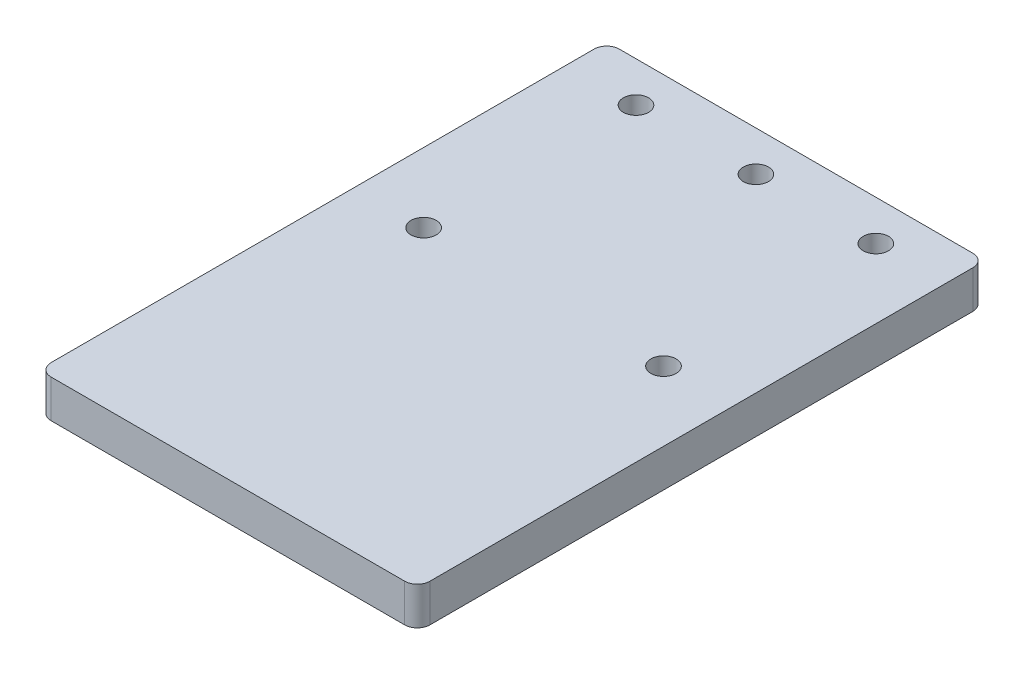
ISO-10303-21;
HEADER;
FILE_DESCRIPTION(('STEP AP214'),'2;1');
FILE_NAME('part.step','',(''),(''),'','','');
FILE_SCHEMA(('AUTOMOTIVE_DESIGN { 1 0 10303 214 1 1 1 1 }'));
ENDSEC;
DATA;
#1=APPLICATION_CONTEXT('core data for automotive mechanical design processes');
#2=APPLICATION_PROTOCOL_DEFINITION('international standard','automotive_design',2000,#1);
#3=PRODUCT_CONTEXT('',#1,'mechanical');
#4=PRODUCT('Part','Part','',(#3));
#5=PRODUCT_RELATED_PRODUCT_CATEGORY('part','',(#4));
#6=PRODUCT_DEFINITION_FORMATION('','',#4);
#7=PRODUCT_DEFINITION_CONTEXT('part definition',#1,'design');
#8=PRODUCT_DEFINITION('design','',#6,#7);
#9=PRODUCT_DEFINITION_SHAPE('','',#8);
#10=(LENGTH_UNIT() NAMED_UNIT(*) SI_UNIT(.MILLI.,.METRE.));
#11=(NAMED_UNIT(*) PLANE_ANGLE_UNIT() SI_UNIT($,.RADIAN.));
#12=(NAMED_UNIT(*) SI_UNIT($,.STERADIAN.) SOLID_ANGLE_UNIT());
#13=UNCERTAINTY_MEASURE_WITH_UNIT(LENGTH_MEASURE(1.E-05),#10,'distance_accuracy_value','');
#14=(GEOMETRIC_REPRESENTATION_CONTEXT(3) GLOBAL_UNCERTAINTY_ASSIGNED_CONTEXT((#13)) GLOBAL_UNIT_ASSIGNED_CONTEXT((#10,
#11,#12)) REPRESENTATION_CONTEXT('',''));
#15=CARTESIAN_POINT('',(0.,0.,0.));
#16=DIRECTION('',(0.,0.,1.));
#17=DIRECTION('',(1.,0.,0.));
#18=AXIS2_PLACEMENT_3D('',#15,#16,#17);
#19=CARTESIAN_POINT('',(0.,3.,0.));
#20=DIRECTION('',(0.,1.,0.));
#21=DIRECTION('',(0.,0.,1.));
#22=AXIS2_PLACEMENT_3D('',#19,#20,#21);
#23=PLANE('',#22);
#24=CARTESIAN_POINT('',(24.5,3.,3.18));
#25=DIRECTION('',(0.,1.,0.));
#26=DIRECTION('',(0.,0.,1.));
#27=AXIS2_PLACEMENT_3D('',#24,#25,#26);
#28=CIRCLE('',#27,0.999999999999998);
#29=CARTESIAN_POINT('',(24.5,3.,4.18));
#30=VERTEX_POINT('',#29);
#31=EDGE_CURVE('E235',#30,#30,#28,.T.);
#32=ORIENTED_EDGE('',*,*,#31,.F.);
#33=EDGE_LOOP('',(#32));
#34=FACE_BOUND('',#33,.T.);
#35=CARTESIAN_POINT('',(5.5,3.,20.));
#36=DIRECTION('',(0.,1.,0.));
#37=DIRECTION('',(0.,0.,1.));
#38=AXIS2_PLACEMENT_3D('',#35,#36,#37);
#39=CIRCLE('',#38,1.);
#40=CARTESIAN_POINT('',(5.5,3.,21.));
#41=VERTEX_POINT('',#40);
#42=EDGE_CURVE('E221',#41,#41,#39,.T.);
#43=ORIENTED_EDGE('',*,*,#42,.F.);
#44=EDGE_LOOP('',(#43));
#45=FACE_BOUND('',#44,.T.);
#46=DIRECTION('',(-1.,0.,0.));
#47=VECTOR('',#46,1.);
#48=CARTESIAN_POINT('',(0.,3.,0.));
#49=LINE('',#48,#47);
#50=CARTESIAN_POINT('',(29.,3.,0.));
#51=VERTEX_POINT('',#50);
#52=CARTESIAN_POINT('',(1.,3.,0.));
#53=VERTEX_POINT('',#52);
#54=EDGE_CURVE('E153',#51,#53,#49,.T.);
#55=ORIENTED_EDGE('',*,*,#54,.T.);
#56=CARTESIAN_POINT('',(1.,3.,1.));
#57=DIRECTION('',(0.,1.,0.));
#58=DIRECTION('',(0.,0.,1.));
#59=AXIS2_PLACEMENT_3D('',#56,#57,#58);
#60=CIRCLE('',#59,1.);
#61=CARTESIAN_POINT('',(0.,3.,1.));
#62=VERTEX_POINT('',#61);
#63=EDGE_CURVE('E182',#53,#62,#60,.T.);
#64=ORIENTED_EDGE('',*,*,#63,.T.);
#65=DIRECTION('',(0.,0.,1.));
#66=VECTOR('',#65,1.);
#67=CARTESIAN_POINT('',(0.,3.,0.));
#68=LINE('',#67,#66);
#69=CARTESIAN_POINT('',(0.,3.,44.));
#70=VERTEX_POINT('',#69);
#71=EDGE_CURVE('E131',#62,#70,#68,.T.);
#72=ORIENTED_EDGE('',*,*,#71,.T.);
#73=CARTESIAN_POINT('',(1.00000000000001,3.,44.));
#74=DIRECTION('',(0.,1.,0.));
#75=DIRECTION('',(0.,0.,1.));
#76=AXIS2_PLACEMENT_3D('',#73,#74,#75);
#77=CIRCLE('',#76,1.);
#78=CARTESIAN_POINT('',(1.00000000000001,3.,45.));
#79=VERTEX_POINT('',#78);
#80=EDGE_CURVE('E176',#70,#79,#77,.T.);
#81=ORIENTED_EDGE('',*,*,#80,.T.);
#82=DIRECTION('',(1.,0.,0.));
#83=VECTOR('',#82,1.);
#84=CARTESIAN_POINT('',(0.,3.,45.));
#85=LINE('',#84,#83);
#86=CARTESIAN_POINT('',(29.,3.,45.));
#87=VERTEX_POINT('',#86);
#88=EDGE_CURVE('E195',#79,#87,#85,.T.);
#89=ORIENTED_EDGE('',*,*,#88,.T.);
#90=CARTESIAN_POINT('',(29.,3.,44.));
#91=DIRECTION('',(0.,1.,0.));
#92=DIRECTION('',(0.,0.,1.));
#93=AXIS2_PLACEMENT_3D('',#90,#91,#92);
#94=CIRCLE('',#93,1.);
#95=CARTESIAN_POINT('',(30.,3.,44.));
#96=VERTEX_POINT('',#95);
#97=EDGE_CURVE('E65',#87,#96,#94,.T.);
#98=ORIENTED_EDGE('',*,*,#97,.T.);
#99=DIRECTION('',(0.,0.,-1.));
#100=VECTOR('',#99,1.);
#101=CARTESIAN_POINT('',(30.,3.,0.));
#102=LINE('',#101,#100);
#103=CARTESIAN_POINT('',(30.,3.,1.));
#104=VERTEX_POINT('',#103);
#105=EDGE_CURVE('E202',#96,#104,#102,.T.);
#106=ORIENTED_EDGE('',*,*,#105,.T.);
#107=CARTESIAN_POINT('',(29.,3.,1.));
#108=DIRECTION('',(0.,1.,0.));
#109=DIRECTION('',(0.,0.,1.));
#110=AXIS2_PLACEMENT_3D('',#107,#108,#109);
#111=CIRCLE('',#110,1.);
#112=EDGE_CURVE('E179',#104,#51,#111,.T.);
#113=ORIENTED_EDGE('',*,*,#112,.T.);
#114=EDGE_LOOP('',(#55,#64,#72,#81,#89,#98,#106,#113));
#115=FACE_BOUND('',#114,.T.);
#116=CARTESIAN_POINT('',(15.,3.,3.18));
#117=DIRECTION('',(0.,1.,0.));
#118=DIRECTION('',(0.,0.,1.));
#119=AXIS2_PLACEMENT_3D('',#116,#117,#118);
#120=CIRCLE('',#119,1.);
#121=CARTESIAN_POINT('',(15.,3.,4.18));
#122=VERTEX_POINT('',#121);
#123=EDGE_CURVE('E142',#122,#122,#120,.T.);
#124=ORIENTED_EDGE('',*,*,#123,.F.);
#125=EDGE_LOOP('',(#124));
#126=FACE_BOUND('',#125,.T.);
#127=CARTESIAN_POINT('',(24.5,3.,20.));
#128=DIRECTION('',(0.,1.,0.));
#129=DIRECTION('',(0.,0.,1.));
#130=AXIS2_PLACEMENT_3D('',#127,#128,#129);
#131=CIRCLE('',#130,0.999999999999998);
#132=CARTESIAN_POINT('',(24.5,3.,21.));
#133=VERTEX_POINT('',#132);
#134=EDGE_CURVE('E227',#133,#133,#131,.T.);
#135=ORIENTED_EDGE('',*,*,#134,.F.);
#136=EDGE_LOOP('',(#135));
#137=FACE_BOUND('',#136,.T.);
#138=CARTESIAN_POINT('',(5.5,3.,3.18));
#139=DIRECTION('',(0.,1.,0.));
#140=DIRECTION('',(0.,0.,1.));
#141=AXIS2_PLACEMENT_3D('',#138,#139,#140);
#142=CIRCLE('',#141,1.);
#143=CARTESIAN_POINT('',(5.5,3.,4.18));
#144=VERTEX_POINT('',#143);
#145=EDGE_CURVE('E243',#144,#144,#142,.T.);
#146=ORIENTED_EDGE('',*,*,#145,.F.);
#147=EDGE_LOOP('',(#146));
#148=FACE_BOUND('',#147,.T.);
#149=ADVANCED_FACE('F42',(#34,#45,#115,#126,#137,#148),#23,.T.);
#150=CARTESIAN_POINT('',(0.,0.,0.));
#151=DIRECTION('',(0.,1.,0.));
#152=DIRECTION('',(0.,0.,1.));
#153=AXIS2_PLACEMENT_3D('',#150,#151,#152);
#154=PLANE('',#153);
#155=DIRECTION('',(0.,0.,1.));
#156=VECTOR('',#155,1.);
#157=CARTESIAN_POINT('',(0.,0.,0.));
#158=LINE('',#157,#156);
#159=CARTESIAN_POINT('',(0.,0.,1.));
#160=VERTEX_POINT('',#159);
#161=CARTESIAN_POINT('',(0.,0.,44.));
#162=VERTEX_POINT('',#161);
#163=EDGE_CURVE('E128',#160,#162,#158,.T.);
#164=ORIENTED_EDGE('',*,*,#163,.F.);
#165=CARTESIAN_POINT('',(1.,0.,1.));
#166=DIRECTION('',(0.,1.,0.));
#167=DIRECTION('',(0.,0.,1.));
#168=AXIS2_PLACEMENT_3D('',#165,#166,#167);
#169=CIRCLE('',#168,1.);
#170=CARTESIAN_POINT('',(1.,0.,0.));
#171=VERTEX_POINT('',#170);
#172=EDGE_CURVE('E110',#160,#171,#169,.F.);
#173=ORIENTED_EDGE('',*,*,#172,.T.);
#174=DIRECTION('',(-1.,0.,0.));
#175=VECTOR('',#174,1.);
#176=CARTESIAN_POINT('',(0.,0.,0.));
#177=LINE('',#176,#175);
#178=CARTESIAN_POINT('',(29.,0.,0.));
#179=VERTEX_POINT('',#178);
#180=EDGE_CURVE('E158',#179,#171,#177,.T.);
#181=ORIENTED_EDGE('',*,*,#180,.F.);
#182=CARTESIAN_POINT('',(29.,0.,1.));
#183=DIRECTION('',(0.,1.,0.));
#184=DIRECTION('',(0.,0.,1.));
#185=AXIS2_PLACEMENT_3D('',#182,#183,#184);
#186=CIRCLE('',#185,1.);
#187=CARTESIAN_POINT('',(30.,0.,1.));
#188=VERTEX_POINT('',#187);
#189=EDGE_CURVE('E122',#179,#188,#186,.F.);
#190=ORIENTED_EDGE('',*,*,#189,.T.);
#191=DIRECTION('',(0.,0.,-1.));
#192=VECTOR('',#191,1.);
#193=CARTESIAN_POINT('',(30.,0.,0.));
#194=LINE('',#193,#192);
#195=CARTESIAN_POINT('',(30.,0.,44.));
#196=VERTEX_POINT('',#195);
#197=EDGE_CURVE('E147',#196,#188,#194,.T.);
#198=ORIENTED_EDGE('',*,*,#197,.F.);
#199=CARTESIAN_POINT('',(29.,0.,44.));
#200=DIRECTION('',(0.,1.,0.));
#201=DIRECTION('',(0.,0.,1.));
#202=AXIS2_PLACEMENT_3D('',#199,#200,#201);
#203=CIRCLE('',#202,1.);
#204=CARTESIAN_POINT('',(29.,0.,45.));
#205=VERTEX_POINT('',#204);
#206=EDGE_CURVE('E133',#196,#205,#203,.F.);
#207=ORIENTED_EDGE('',*,*,#206,.T.);
#208=DIRECTION('',(1.,0.,0.));
#209=VECTOR('',#208,1.);
#210=CARTESIAN_POINT('',(0.,0.,45.));
#211=LINE('',#210,#209);
#212=CARTESIAN_POINT('',(1.00000000000001,0.,45.));
#213=VERTEX_POINT('',#212);
#214=EDGE_CURVE('E141',#213,#205,#211,.T.);
#215=ORIENTED_EDGE('',*,*,#214,.F.);
#216=CARTESIAN_POINT('',(1.00000000000001,0.,44.));
#217=DIRECTION('',(0.,1.,0.));
#218=DIRECTION('',(0.,0.,1.));
#219=AXIS2_PLACEMENT_3D('',#216,#217,#218);
#220=CIRCLE('',#219,1.);
#221=EDGE_CURVE('E139',#213,#162,#220,.F.);
#222=ORIENTED_EDGE('',*,*,#221,.T.);
#223=EDGE_LOOP('',(#164,#173,#181,#190,#198,#207,#215,#222));
#224=FACE_BOUND('',#223,.T.);
#225=CARTESIAN_POINT('',(15.,0.,3.18));
#226=DIRECTION('',(0.,1.,0.));
#227=DIRECTION('',(0.,0.,1.));
#228=AXIS2_PLACEMENT_3D('',#225,#226,#227);
#229=CIRCLE('',#228,1.);
#230=CARTESIAN_POINT('',(15.,0.,4.18));
#231=VERTEX_POINT('',#230);
#232=EDGE_CURVE('E150',#231,#231,#229,.T.);
#233=ORIENTED_EDGE('',*,*,#232,.T.);
#234=EDGE_LOOP('',(#233));
#235=FACE_BOUND('',#234,.T.);
#236=CARTESIAN_POINT('',(5.5,0.,20.));
#237=DIRECTION('',(0.,1.,0.));
#238=DIRECTION('',(0.,0.,1.));
#239=AXIS2_PLACEMENT_3D('',#236,#237,#238);
#240=CIRCLE('',#239,1.);
#241=CARTESIAN_POINT('',(5.5,0.,21.));
#242=VERTEX_POINT('',#241);
#243=EDGE_CURVE('E223',#242,#242,#240,.T.);
#244=ORIENTED_EDGE('',*,*,#243,.T.);
#245=EDGE_LOOP('',(#244));
#246=FACE_BOUND('',#245,.T.);
#247=CARTESIAN_POINT('',(24.5,0.,20.));
#248=DIRECTION('',(0.,1.,0.));
#249=DIRECTION('',(0.,0.,1.));
#250=AXIS2_PLACEMENT_3D('',#247,#248,#249);
#251=CIRCLE('',#250,0.999999999999998);
#252=CARTESIAN_POINT('',(24.5,0.,21.));
#253=VERTEX_POINT('',#252);
#254=EDGE_CURVE('E231',#253,#253,#251,.T.);
#255=ORIENTED_EDGE('',*,*,#254,.T.);
#256=EDGE_LOOP('',(#255));
#257=FACE_BOUND('',#256,.T.);
#258=CARTESIAN_POINT('',(24.5,0.,3.18));
#259=DIRECTION('',(0.,1.,0.));
#260=DIRECTION('',(0.,0.,1.));
#261=AXIS2_PLACEMENT_3D('',#258,#259,#260);
#262=CIRCLE('',#261,0.999999999999998);
#263=CARTESIAN_POINT('',(24.5,0.,4.18));
#264=VERTEX_POINT('',#263);
#265=EDGE_CURVE('E239',#264,#264,#262,.T.);
#266=ORIENTED_EDGE('',*,*,#265,.T.);
#267=EDGE_LOOP('',(#266));
#268=FACE_BOUND('',#267,.T.);
#269=CARTESIAN_POINT('',(5.5,0.,3.18));
#270=DIRECTION('',(0.,1.,0.));
#271=DIRECTION('',(0.,0.,1.));
#272=AXIS2_PLACEMENT_3D('',#269,#270,#271);
#273=CIRCLE('',#272,1.);
#274=CARTESIAN_POINT('',(5.5,0.,4.18));
#275=VERTEX_POINT('',#274);
#276=EDGE_CURVE('E247',#275,#275,#273,.T.);
#277=ORIENTED_EDGE('',*,*,#276,.T.);
#278=EDGE_LOOP('',(#277));
#279=FACE_BOUND('',#278,.T.);
#280=ADVANCED_FACE('F136',(#224,#235,#246,#257,#268,#279),#154,.F.);
#281=CARTESIAN_POINT('',(0.,3.,0.));
#282=DIRECTION('',(1.,0.,0.));
#283=DIRECTION('',(0.,0.,-1.));
#284=AXIS2_PLACEMENT_3D('',#281,#282,#283);
#285=PLANE('',#284);
#286=ORIENTED_EDGE('',*,*,#71,.F.);
#287=DIRECTION('',(0.,-1.,0.));
#288=VECTOR('',#287,1.);
#289=CARTESIAN_POINT('',(0.,3.,1.));
#290=LINE('',#289,#288);
#291=EDGE_CURVE('E114',#62,#160,#290,.T.);
#292=ORIENTED_EDGE('',*,*,#291,.T.);
#293=ORIENTED_EDGE('',*,*,#163,.T.);
#294=DIRECTION('',(0.,-1.,0.));
#295=VECTOR('',#294,1.);
#296=CARTESIAN_POINT('',(0.,3.,44.));
#297=LINE('',#296,#295);
#298=EDGE_CURVE('E134',#162,#70,#297,.F.);
#299=ORIENTED_EDGE('',*,*,#298,.T.);
#300=EDGE_LOOP('',(#286,#292,#293,#299));
#301=FACE_BOUND('',#300,.T.);
#302=ADVANCED_FACE('F127',(#301),#285,.F.);
#303=CARTESIAN_POINT('',(0.,3.,45.));
#304=DIRECTION('',(0.,0.,-1.));
#305=DIRECTION('',(-1.,0.,0.));
#306=AXIS2_PLACEMENT_3D('',#303,#304,#305);
#307=PLANE('',#306);
#308=ORIENTED_EDGE('',*,*,#88,.F.);
#309=DIRECTION('',(0.,-1.,0.));
#310=VECTOR('',#309,1.);
#311=CARTESIAN_POINT('',(1.00000000000001,3.,45.));
#312=LINE('',#311,#310);
#313=EDGE_CURVE('E11',#79,#213,#312,.T.);
#314=ORIENTED_EDGE('',*,*,#313,.T.);
#315=ORIENTED_EDGE('',*,*,#214,.T.);
#316=DIRECTION('',(0.,-1.,0.));
#317=VECTOR('',#316,1.);
#318=CARTESIAN_POINT('',(29.,3.,45.));
#319=LINE('',#318,#317);
#320=EDGE_CURVE('E51',#205,#87,#319,.F.);
#321=ORIENTED_EDGE('',*,*,#320,.T.);
#322=EDGE_LOOP('',(#308,#314,#315,#321));
#323=FACE_BOUND('',#322,.T.);
#324=ADVANCED_FACE('F194',(#323),#307,.F.);
#325=CARTESIAN_POINT('',(30.,3.,0.));
#326=DIRECTION('',(-1.,0.,0.));
#327=DIRECTION('',(0.,0.,1.));
#328=AXIS2_PLACEMENT_3D('',#325,#326,#327);
#329=PLANE('',#328);
#330=ORIENTED_EDGE('',*,*,#197,.T.);
#331=DIRECTION('',(0.,-1.,0.));
#332=VECTOR('',#331,1.);
#333=CARTESIAN_POINT('',(30.,3.,1.));
#334=LINE('',#333,#332);
#335=EDGE_CURVE('E58',#188,#104,#334,.F.);
#336=ORIENTED_EDGE('',*,*,#335,.T.);
#337=ORIENTED_EDGE('',*,*,#105,.F.);
#338=DIRECTION('',(0.,-1.,0.));
#339=VECTOR('',#338,1.);
#340=CARTESIAN_POINT('',(30.,3.,44.));
#341=LINE('',#340,#339);
#342=EDGE_CURVE('E185',#96,#196,#341,.T.);
#343=ORIENTED_EDGE('',*,*,#342,.T.);
#344=EDGE_LOOP('',(#330,#336,#337,#343));
#345=FACE_BOUND('',#344,.T.);
#346=ADVANCED_FACE('F206',(#345),#329,.F.);
#347=CARTESIAN_POINT('',(0.,3.,0.));
#348=DIRECTION('',(0.,0.,1.));
#349=DIRECTION('',(1.,0.,0.));
#350=AXIS2_PLACEMENT_3D('',#347,#348,#349);
#351=PLANE('',#350);
#352=ORIENTED_EDGE('',*,*,#180,.T.);
#353=DIRECTION('',(0.,-1.,0.));
#354=VECTOR('',#353,1.);
#355=CARTESIAN_POINT('',(1.,3.,0.));
#356=LINE('',#355,#354);
#357=EDGE_CURVE('E115',#171,#53,#356,.F.);
#358=ORIENTED_EDGE('',*,*,#357,.T.);
#359=ORIENTED_EDGE('',*,*,#54,.F.);
#360=DIRECTION('',(0.,-1.,0.));
#361=VECTOR('',#360,1.);
#362=CARTESIAN_POINT('',(29.,3.,0.));
#363=LINE('',#362,#361);
#364=EDGE_CURVE('E121',#51,#179,#363,.T.);
#365=ORIENTED_EDGE('',*,*,#364,.T.);
#366=EDGE_LOOP('',(#352,#358,#359,#365));
#367=FACE_BOUND('',#366,.T.);
#368=ADVANCED_FACE('F213',(#367),#351,.F.);
#369=CARTESIAN_POINT('',(15.,3.,3.18));
#370=DIRECTION('',(0.,-1.,0.));
#371=DIRECTION('',(0.,0.,-1.));
#372=AXIS2_PLACEMENT_3D('',#369,#370,#371);
#373=CYLINDRICAL_SURFACE('',#372,1.);
#374=ORIENTED_EDGE('',*,*,#123,.T.);
#375=EDGE_LOOP('',(#374));
#376=FACE_BOUND('',#375,.T.);
#377=ORIENTED_EDGE('',*,*,#232,.F.);
#378=EDGE_LOOP('',(#377));
#379=FACE_BOUND('',#378,.T.);
#380=ADVANCED_FACE('F269',(#376,#379),#373,.F.);
#381=CARTESIAN_POINT('',(5.5,3.,20.));
#382=DIRECTION('',(0.,-1.,0.));
#383=DIRECTION('',(0.,0.,-1.));
#384=AXIS2_PLACEMENT_3D('',#381,#382,#383);
#385=CYLINDRICAL_SURFACE('',#384,1.);
#386=ORIENTED_EDGE('',*,*,#42,.T.);
#387=EDGE_LOOP('',(#386));
#388=FACE_BOUND('',#387,.T.);
#389=ORIENTED_EDGE('',*,*,#243,.F.);
#390=EDGE_LOOP('',(#389));
#391=FACE_BOUND('',#390,.T.);
#392=ADVANCED_FACE('F368',(#388,#391),#385,.F.);
#393=CARTESIAN_POINT('',(24.5,3.,20.));
#394=DIRECTION('',(0.,-1.,0.));
#395=DIRECTION('',(0.,0.,-1.));
#396=AXIS2_PLACEMENT_3D('',#393,#394,#395);
#397=CYLINDRICAL_SURFACE('',#396,0.999999999999998);
#398=ORIENTED_EDGE('',*,*,#134,.T.);
#399=EDGE_LOOP('',(#398));
#400=FACE_BOUND('',#399,.T.);
#401=ORIENTED_EDGE('',*,*,#254,.F.);
#402=EDGE_LOOP('',(#401));
#403=FACE_BOUND('',#402,.T.);
#404=ADVANCED_FACE('F377',(#400,#403),#397,.F.);
#405=CARTESIAN_POINT('',(24.5,3.,3.18));
#406=DIRECTION('',(0.,-1.,0.));
#407=DIRECTION('',(0.,0.,-1.));
#408=AXIS2_PLACEMENT_3D('',#405,#406,#407);
#409=CYLINDRICAL_SURFACE('',#408,0.999999999999998);
#410=ORIENTED_EDGE('',*,*,#31,.T.);
#411=EDGE_LOOP('',(#410));
#412=FACE_BOUND('',#411,.T.);
#413=ORIENTED_EDGE('',*,*,#265,.F.);
#414=EDGE_LOOP('',(#413));
#415=FACE_BOUND('',#414,.T.);
#416=ADVANCED_FACE('F386',(#412,#415),#409,.F.);
#417=CARTESIAN_POINT('',(5.5,3.,3.18));
#418=DIRECTION('',(0.,-1.,0.));
#419=DIRECTION('',(0.,0.,-1.));
#420=AXIS2_PLACEMENT_3D('',#417,#418,#419);
#421=CYLINDRICAL_SURFACE('',#420,1.);
#422=ORIENTED_EDGE('',*,*,#145,.T.);
#423=EDGE_LOOP('',(#422));
#424=FACE_BOUND('',#423,.T.);
#425=ORIENTED_EDGE('',*,*,#276,.F.);
#426=EDGE_LOOP('',(#425));
#427=FACE_BOUND('',#426,.T.);
#428=ADVANCED_FACE('F255',(#424,#427),#421,.F.);
#429=CARTESIAN_POINT('',(1.,3.,1.));
#430=DIRECTION('',(0.,-1.,0.));
#431=DIRECTION('',(0.,0.,-1.));
#432=AXIS2_PLACEMENT_3D('',#429,#430,#431);
#433=CYLINDRICAL_SURFACE('',#432,1.);
#434=ORIENTED_EDGE('',*,*,#63,.F.);
#435=ORIENTED_EDGE('',*,*,#357,.F.);
#436=ORIENTED_EDGE('',*,*,#172,.F.);
#437=ORIENTED_EDGE('',*,*,#291,.F.);
#438=EDGE_LOOP('',(#434,#435,#436,#437));
#439=FACE_BOUND('',#438,.T.);
#440=ADVANCED_FACE('F113',(#439),#433,.T.);
#441=CARTESIAN_POINT('',(29.,3.,1.));
#442=DIRECTION('',(0.,-1.,0.));
#443=DIRECTION('',(0.,0.,-1.));
#444=AXIS2_PLACEMENT_3D('',#441,#442,#443);
#445=CYLINDRICAL_SURFACE('',#444,1.);
#446=ORIENTED_EDGE('',*,*,#112,.F.);
#447=ORIENTED_EDGE('',*,*,#335,.F.);
#448=ORIENTED_EDGE('',*,*,#189,.F.);
#449=ORIENTED_EDGE('',*,*,#364,.F.);
#450=EDGE_LOOP('',(#446,#447,#448,#449));
#451=FACE_BOUND('',#450,.T.);
#452=ADVANCED_FACE('F210',(#451),#445,.T.);
#453=CARTESIAN_POINT('',(1.00000000000001,3.,44.));
#454=DIRECTION('',(0.,-1.,0.));
#455=DIRECTION('',(0.,0.,-1.));
#456=AXIS2_PLACEMENT_3D('',#453,#454,#455);
#457=CYLINDRICAL_SURFACE('',#456,1.);
#458=ORIENTED_EDGE('',*,*,#80,.F.);
#459=ORIENTED_EDGE('',*,*,#298,.F.);
#460=ORIENTED_EDGE('',*,*,#221,.F.);
#461=ORIENTED_EDGE('',*,*,#313,.F.);
#462=EDGE_LOOP('',(#458,#459,#460,#461));
#463=FACE_BOUND('',#462,.T.);
#464=ADVANCED_FACE('F283',(#463),#457,.T.);
#465=CARTESIAN_POINT('',(29.,3.,44.));
#466=DIRECTION('',(0.,-1.,0.));
#467=DIRECTION('',(0.,0.,-1.));
#468=AXIS2_PLACEMENT_3D('',#465,#466,#467);
#469=CYLINDRICAL_SURFACE('',#468,1.);
#470=ORIENTED_EDGE('',*,*,#97,.F.);
#471=ORIENTED_EDGE('',*,*,#320,.F.);
#472=ORIENTED_EDGE('',*,*,#206,.F.);
#473=ORIENTED_EDGE('',*,*,#342,.F.);
#474=EDGE_LOOP('',(#470,#471,#472,#473));
#475=FACE_BOUND('',#474,.T.);
#476=ADVANCED_FACE('F44',(#475),#469,.T.);
#477=CLOSED_SHELL('',(#149,#280,#302,#324,#346,#368,#380,#392,#404,#416,#428,#440,#452,#464,#476));
#478=MANIFOLD_SOLID_BREP('B2',#477);
#479=ADVANCED_BREP_SHAPE_REPRESENTATION('',(#18,#478),#14);
#480=SHAPE_DEFINITION_REPRESENTATION(#9,#479);
ENDSEC;
END-ISO-10303-21;
